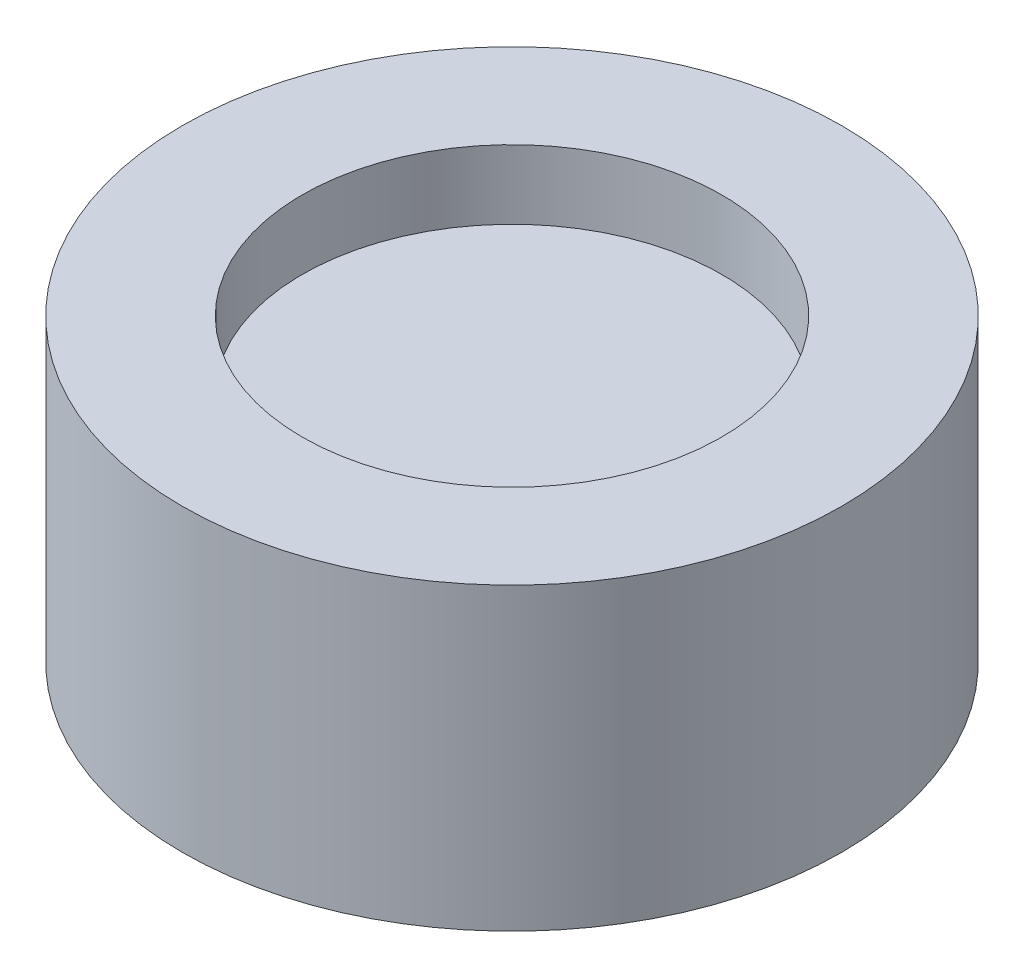
ISO-10303-21;
HEADER;
FILE_DESCRIPTION(('STEP AP214'),'2;1');
FILE_NAME('part.step','',(''),(''),'','','');
FILE_SCHEMA(('AUTOMOTIVE_DESIGN { 1 0 10303 214 1 1 1 1 }'));
ENDSEC;
DATA;
#1=APPLICATION_CONTEXT('core data for automotive mechanical design processes');
#2=APPLICATION_PROTOCOL_DEFINITION('international standard','automotive_design',2000,#1);
#3=PRODUCT_CONTEXT('',#1,'mechanical');
#4=PRODUCT('Part','Part','',(#3));
#5=PRODUCT_RELATED_PRODUCT_CATEGORY('part','',(#4));
#6=PRODUCT_DEFINITION_FORMATION('','',#4);
#7=PRODUCT_DEFINITION_CONTEXT('part definition',#1,'design');
#8=PRODUCT_DEFINITION('design','',#6,#7);
#9=PRODUCT_DEFINITION_SHAPE('','',#8);
#10=(LENGTH_UNIT() NAMED_UNIT(*) SI_UNIT(.MILLI.,.METRE.));
#11=(NAMED_UNIT(*) PLANE_ANGLE_UNIT() SI_UNIT($,.RADIAN.));
#12=(NAMED_UNIT(*) SI_UNIT($,.STERADIAN.) SOLID_ANGLE_UNIT());
#13=UNCERTAINTY_MEASURE_WITH_UNIT(LENGTH_MEASURE(1.E-05),#10,'distance_accuracy_value','');
#14=(GEOMETRIC_REPRESENTATION_CONTEXT(3) GLOBAL_UNCERTAINTY_ASSIGNED_CONTEXT((#13)) GLOBAL_UNIT_ASSIGNED_CONTEXT((#10,
#11,#12)) REPRESENTATION_CONTEXT('',''));
#15=CARTESIAN_POINT('',(0.,0.,0.));
#16=DIRECTION('',(0.,0.,1.));
#17=DIRECTION('',(1.,0.,0.));
#18=AXIS2_PLACEMENT_3D('',#15,#16,#17);
#19=CARTESIAN_POINT('',(0.,10.,0.));
#20=DIRECTION('',(0.,-1.,0.));
#21=DIRECTION('',(0.,0.,-1.));
#22=AXIS2_PLACEMENT_3D('',#19,#20,#21);
#23=CYLINDRICAL_SURFACE('',#22,11.);
#24=CARTESIAN_POINT('',(0.,10.,0.));
#25=DIRECTION('',(0.,1.,0.));
#26=DIRECTION('',(0.,0.,1.));
#27=AXIS2_PLACEMENT_3D('',#24,#25,#26);
#28=CIRCLE('',#27,11.);
#29=CARTESIAN_POINT('',(0.,10.,11.));
#30=VERTEX_POINT('',#29);
#31=EDGE_CURVE('E10',#30,#30,#28,.T.);
#32=ORIENTED_EDGE('',*,*,#31,.F.);
#33=EDGE_LOOP('',(#32));
#34=FACE_BOUND('',#33,.T.);
#35=CARTESIAN_POINT('',(0.,0.,0.));
#36=DIRECTION('',(0.,1.,0.));
#37=DIRECTION('',(0.,0.,1.));
#38=AXIS2_PLACEMENT_3D('',#35,#36,#37);
#39=CIRCLE('',#38,11.);
#40=CARTESIAN_POINT('',(0.,0.,11.));
#41=VERTEX_POINT('',#40);
#42=EDGE_CURVE('E40',#41,#41,#39,.T.);
#43=ORIENTED_EDGE('',*,*,#42,.T.);
#44=EDGE_LOOP('',(#43));
#45=FACE_BOUND('',#44,.T.);
#46=ADVANCED_FACE('F37',(#34,#45),#23,.T.);
#47=CARTESIAN_POINT('',(0.,10.,0.));
#48=DIRECTION('',(0.,1.,0.));
#49=DIRECTION('',(0.,0.,1.));
#50=AXIS2_PLACEMENT_3D('',#47,#48,#49);
#51=PLANE('',#50);
#52=CARTESIAN_POINT('',(0.,10.,0.));
#53=DIRECTION('',(0.,1.,0.));
#54=DIRECTION('',(0.,0.,1.));
#55=AXIS2_PLACEMENT_3D('',#52,#53,#54);
#56=CIRCLE('',#55,7.);
#57=CARTESIAN_POINT('',(0.,10.,7.));
#58=VERTEX_POINT('',#57);
#59=EDGE_CURVE('E51',#58,#58,#56,.T.);
#60=ORIENTED_EDGE('',*,*,#59,.F.);
#61=EDGE_LOOP('',(#60));
#62=FACE_BOUND('',#61,.T.);
#63=ORIENTED_EDGE('',*,*,#31,.T.);
#64=EDGE_LOOP('',(#63));
#65=FACE_BOUND('',#64,.T.);
#66=ADVANCED_FACE('F68',(#62,#65),#51,.T.);
#67=CARTESIAN_POINT('',(0.,0.,0.));
#68=DIRECTION('',(0.,1.,0.));
#69=DIRECTION('',(0.,0.,1.));
#70=AXIS2_PLACEMENT_3D('',#67,#68,#69);
#71=PLANE('',#70);
#72=ORIENTED_EDGE('',*,*,#42,.F.);
#73=EDGE_LOOP('',(#72));
#74=FACE_BOUND('',#73,.T.);
#75=ADVANCED_FACE('F64',(#74),#71,.F.);
#76=CARTESIAN_POINT('',(0.,7.7,0.));
#77=DIRECTION('',(0.,1.,0.));
#78=DIRECTION('',(0.,0.,1.));
#79=AXIS2_PLACEMENT_3D('',#76,#77,#78);
#80=CYLINDRICAL_SURFACE('',#79,7.);
#81=CARTESIAN_POINT('',(0.,7.7,0.));
#82=DIRECTION('',(0.,1.,0.));
#83=DIRECTION('',(0.,0.,1.));
#84=AXIS2_PLACEMENT_3D('',#81,#82,#83);
#85=CIRCLE('',#84,7.);
#86=CARTESIAN_POINT('',(0.,7.7,7.));
#87=VERTEX_POINT('',#86);
#88=EDGE_CURVE('E49',#87,#87,#85,.T.);
#89=ORIENTED_EDGE('',*,*,#88,.F.);
#90=EDGE_LOOP('',(#89));
#91=FACE_BOUND('',#90,.T.);
#92=ORIENTED_EDGE('',*,*,#59,.T.);
#93=EDGE_LOOP('',(#92));
#94=FACE_BOUND('',#93,.T.);
#95=ADVANCED_FACE('F61',(#91,#94),#80,.F.);
#96=CARTESIAN_POINT('',(0.,7.7,0.));
#97=DIRECTION('',(0.,1.,0.));
#98=DIRECTION('',(0.,0.,1.));
#99=AXIS2_PLACEMENT_3D('',#96,#97,#98);
#100=PLANE('',#99);
#101=ORIENTED_EDGE('',*,*,#88,.T.);
#102=EDGE_LOOP('',(#101));
#103=FACE_BOUND('',#102,.T.);
#104=ADVANCED_FACE('F59',(#103),#100,.T.);
#105=CLOSED_SHELL('',(#46,#66,#75,#95,#104));
#106=MANIFOLD_SOLID_BREP('B2',#105);
#107=ADVANCED_BREP_SHAPE_REPRESENTATION('',(#18,#106),#14);
#108=SHAPE_DEFINITION_REPRESENTATION(#9,#107);
ENDSEC;
END-ISO-10303-21;
